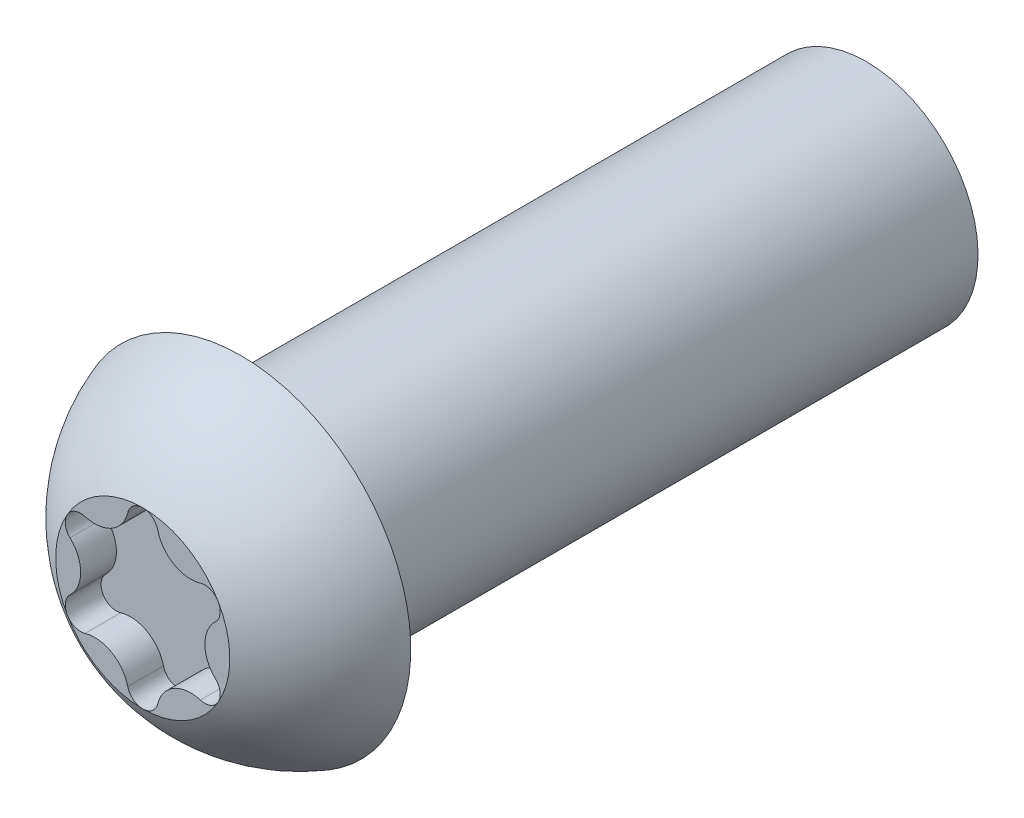
ISO-10303-21;
HEADER;
FILE_DESCRIPTION(('STEP AP214'),'2;1');
FILE_NAME('part.step','',(''),(''),'','','');
FILE_SCHEMA(('AUTOMOTIVE_DESIGN { 1 0 10303 214 1 1 1 1 }'));
ENDSEC;
DATA;
#1=APPLICATION_CONTEXT('core data for automotive mechanical design processes');
#2=APPLICATION_PROTOCOL_DEFINITION('international standard','automotive_design',2000,#1);
#3=PRODUCT_CONTEXT('',#1,'mechanical');
#4=PRODUCT('Part','Part','',(#3));
#5=PRODUCT_RELATED_PRODUCT_CATEGORY('part','',(#4));
#6=PRODUCT_DEFINITION_FORMATION('','',#4);
#7=PRODUCT_DEFINITION_CONTEXT('part definition',#1,'design');
#8=PRODUCT_DEFINITION('design','',#6,#7);
#9=PRODUCT_DEFINITION_SHAPE('','',#8);
#10=(LENGTH_UNIT() NAMED_UNIT(*) SI_UNIT(.MILLI.,.METRE.));
#11=(NAMED_UNIT(*) PLANE_ANGLE_UNIT() SI_UNIT($,.RADIAN.));
#12=(NAMED_UNIT(*) SI_UNIT($,.STERADIAN.) SOLID_ANGLE_UNIT());
#13=UNCERTAINTY_MEASURE_WITH_UNIT(LENGTH_MEASURE(1.E-05),#10,'distance_accuracy_value','');
#14=(GEOMETRIC_REPRESENTATION_CONTEXT(3) GLOBAL_UNCERTAINTY_ASSIGNED_CONTEXT((#13)) GLOBAL_UNIT_ASSIGNED_CONTEXT((#10,
#11,#12)) REPRESENTATION_CONTEXT('',''));
#15=CARTESIAN_POINT('',(0.,0.,0.));
#16=DIRECTION('',(0.,0.,1.));
#17=DIRECTION('',(1.,0.,0.));
#18=AXIS2_PLACEMENT_3D('',#15,#16,#17);
#19=CARTESIAN_POINT('',(0.,0.,2.2));
#20=DIRECTION('',(0.,0.,1.));
#21=DIRECTION('',(0.,-1.,0.));
#22=AXIS2_PLACEMENT_3D('',#19,#20,#21);
#23=PLANE('',#22);
#24=CARTESIAN_POINT('',(1.39012129472943,0.802586903718268,2.2));
#25=DIRECTION('',(0.,0.,1.));
#26=DIRECTION('',(-1.,0.,0.));
#27=AXIS2_PLACEMENT_3D('',#24,#25,#26);
#28=CIRCLE('',#27,0.34482619256347);
#29=CARTESIAN_POINT('',(1.62747995888628,0.552455003258741,2.2));
#30=VERTEX_POINT('',#29);
#31=CARTESIAN_POINT('',(1.68874953737966,0.975000000000003,2.2));
#32=VERTEX_POINT('',#31);
#33=EDGE_CURVE('E223',#30,#32,#28,.T.);
#34=ORIENTED_EDGE('',*,*,#33,.F.);
#35=CARTESIAN_POINT('',(2.15172329346039,0.,2.2));
#36=DIRECTION('',(0.,0.,-1.));
#37=DIRECTION('',(1.,0.,0.));
#38=AXIS2_PLACEMENT_3D('',#35,#36,#37);
#39=CIRCLE('',#38,0.761601998730961);
#40=CARTESIAN_POINT('',(1.62747995888628,-0.552455003258736,2.2));
#41=VERTEX_POINT('',#40);
#42=EDGE_CURVE('E219',#41,#30,#39,.T.);
#43=ORIENTED_EDGE('',*,*,#42,.F.);
#44=CARTESIAN_POINT('',(1.39012129472943,-0.802586903718263,2.2));
#45=DIRECTION('',(0.,0.,1.));
#46=DIRECTION('',(-1.,0.,0.));
#47=AXIS2_PLACEMENT_3D('',#44,#45,#46);
#48=CIRCLE('',#47,0.34482619256347);
#49=CARTESIAN_POINT('',(1.68874953737966,-0.974999999999997,2.2));
#50=VERTEX_POINT('',#49);
#51=EDGE_CURVE('E216',#50,#41,#48,.T.);
#52=ORIENTED_EDGE('',*,*,#51,.F.);
#53=CARTESIAN_POINT('',(0.,0.,2.2));
#54=DIRECTION('',(0.,0.,-1.));
#55=DIRECTION('',(0.,1.,0.));
#56=AXIS2_PLACEMENT_3D('',#53,#54,#55);
#57=CIRCLE('',#56,1.95);
#58=EDGE_CURVE('E45',#32,#50,#57,.T.);
#59=ORIENTED_EDGE('',*,*,#58,.F.);
#60=EDGE_LOOP('',(#34,#43,#52,#59));
#61=FACE_BOUND('',#60,.T.);
#62=ADVANCED_FACE('F37',(#61),#23,.T.);
#63=CARTESIAN_POINT('',(1.29218004671302,1.1332114869162,2.2));
#64=VERTEX_POINT('',#63);
#65=EDGE_CURVE('E222',#32,#64,#28,.T.);
#66=ORIENTED_EDGE('',*,*,#65,.F.);
#67=CARTESIAN_POINT('',(0.,1.95,2.2));
#68=VERTEX_POINT('',#67);
#69=EDGE_CURVE('E11',#68,#32,#57,.T.);
#70=ORIENTED_EDGE('',*,*,#69,.F.);
#71=CARTESIAN_POINT('',(0.,1.60517380743653,2.2));
#72=DIRECTION('',(0.,0.,1.));
#73=DIRECTION('',(-1.,0.,0.));
#74=AXIS2_PLACEMENT_3D('',#71,#72,#73);
#75=CIRCLE('',#74,0.34482619256347);
#76=CARTESIAN_POINT('',(0.335299912173256,1.68566649017494,2.2));
#77=VERTEX_POINT('',#76);
#78=EDGE_CURVE('E61',#77,#68,#75,.T.);
#79=ORIENTED_EDGE('',*,*,#78,.F.);
#80=CARTESIAN_POINT('',(1.07586164673019,1.86344703405141,2.2));
#81=DIRECTION('',(0.,0.,-1.));
#82=DIRECTION('',(1.,0.,0.));
#83=AXIS2_PLACEMENT_3D('',#80,#81,#82);
#84=CIRCLE('',#83,0.76160199873096);
#85=EDGE_CURVE('E225',#64,#77,#84,.T.);
#86=ORIENTED_EDGE('',*,*,#85,.F.);
#87=EDGE_LOOP('',(#66,#70,#79,#86));
#88=FACE_BOUND('',#87,.T.);
#89=ADVANCED_FACE('F308',(#88),#23,.T.);
#90=CARTESIAN_POINT('',(1.29218004671303,-1.1332114869162,2.2));
#91=VERTEX_POINT('',#90);
#92=EDGE_CURVE('E217',#91,#50,#48,.T.);
#93=ORIENTED_EDGE('',*,*,#92,.F.);
#94=CARTESIAN_POINT('',(1.0758616467302,-1.86344703405141,2.2));
#95=DIRECTION('',(0.,0.,-1.));
#96=DIRECTION('',(1.,0.,0.));
#97=AXIS2_PLACEMENT_3D('',#94,#95,#96);
#98=CIRCLE('',#97,0.761601998730961);
#99=CARTESIAN_POINT('',(0.335299912173264,-1.68566649017494,2.2));
#100=VERTEX_POINT('',#99);
#101=EDGE_CURVE('E213',#100,#91,#98,.T.);
#102=ORIENTED_EDGE('',*,*,#101,.F.);
#103=CARTESIAN_POINT('',(0.,-1.60517380743653,2.2));
#104=DIRECTION('',(0.,0.,1.));
#105=DIRECTION('',(-1.,0.,0.));
#106=AXIS2_PLACEMENT_3D('',#103,#104,#105);
#107=CIRCLE('',#106,0.34482619256347);
#108=CARTESIAN_POINT('',(0.,-1.95,2.2));
#109=VERTEX_POINT('',#108);
#110=EDGE_CURVE('E210',#109,#100,#107,.T.);
#111=ORIENTED_EDGE('',*,*,#110,.F.);
#112=EDGE_CURVE('E271',#50,#109,#57,.T.);
#113=ORIENTED_EDGE('',*,*,#112,.F.);
#114=EDGE_LOOP('',(#93,#102,#111,#113));
#115=FACE_BOUND('',#114,.T.);
#116=ADVANCED_FACE('F287',(#115),#23,.T.);
#117=CARTESIAN_POINT('',(-0.335299912173256,1.68566649017494,2.2));
#118=VERTEX_POINT('',#117);
#119=EDGE_CURVE('E170',#68,#118,#75,.T.);
#120=ORIENTED_EDGE('',*,*,#119,.F.);
#121=CARTESIAN_POINT('',(-1.68874953737966,0.974999999999996,2.2));
#122=VERTEX_POINT('',#121);
#123=EDGE_CURVE('E46',#122,#68,#57,.T.);
#124=ORIENTED_EDGE('',*,*,#123,.F.);
#125=CARTESIAN_POINT('',(-1.39012129472943,0.80258690371826,2.2));
#126=DIRECTION('',(0.,0.,1.));
#127=DIRECTION('',(-1.,0.,0.));
#128=AXIS2_PLACEMENT_3D('',#125,#126,#127);
#129=CIRCLE('',#128,0.34482619256347);
#130=CARTESIAN_POINT('',(-1.29218004671302,1.13321148691619,2.2));
#131=VERTEX_POINT('',#130);
#132=EDGE_CURVE('E53',#131,#122,#129,.T.);
#133=ORIENTED_EDGE('',*,*,#132,.F.);
#134=CARTESIAN_POINT('',(-1.07586164673019,1.86344703405141,2.2));
#135=DIRECTION('',(0.,0.,-1.));
#136=DIRECTION('',(1.,0.,0.));
#137=AXIS2_PLACEMENT_3D('',#134,#135,#136);
#138=CIRCLE('',#137,0.761601998730961);
#139=EDGE_CURVE('E153',#118,#131,#138,.T.);
#140=ORIENTED_EDGE('',*,*,#139,.F.);
#141=EDGE_LOOP('',(#120,#124,#133,#140));
#142=FACE_BOUND('',#141,.T.);
#143=ADVANCED_FACE('F300',(#142),#23,.T.);
#144=CARTESIAN_POINT('',(-0.335299912173248,-1.68566649017494,2.2));
#145=VERTEX_POINT('',#144);
#146=EDGE_CURVE('E211',#145,#109,#107,.T.);
#147=ORIENTED_EDGE('',*,*,#146,.F.);
#148=CARTESIAN_POINT('',(-1.07586164673019,-1.86344703405142,2.2));
#149=DIRECTION('',(0.,0.,-1.));
#150=DIRECTION('',(1.,0.,0.));
#151=AXIS2_PLACEMENT_3D('',#148,#149,#150);
#152=CIRCLE('',#151,0.761601998730961);
#153=CARTESIAN_POINT('',(-1.29218004671301,-1.1332114869162,2.2));
#154=VERTEX_POINT('',#153);
#155=EDGE_CURVE('E207',#154,#145,#152,.T.);
#156=ORIENTED_EDGE('',*,*,#155,.F.);
#157=CARTESIAN_POINT('',(-1.39012129472942,-0.802586903718271,2.2));
#158=DIRECTION('',(0.,0.,1.));
#159=DIRECTION('',(-1.,0.,0.));
#160=AXIS2_PLACEMENT_3D('',#157,#158,#159);
#161=CIRCLE('',#160,0.34482619256347);
#162=CARTESIAN_POINT('',(-1.68874953737965,-0.975000000000007,2.2));
#163=VERTEX_POINT('',#162);
#164=EDGE_CURVE('E204',#163,#154,#161,.T.);
#165=ORIENTED_EDGE('',*,*,#164,.F.);
#166=EDGE_CURVE('E268',#109,#163,#57,.T.);
#167=ORIENTED_EDGE('',*,*,#166,.F.);
#168=EDGE_LOOP('',(#147,#156,#165,#167));
#169=FACE_BOUND('',#168,.T.);
#170=ADVANCED_FACE('F293',(#169),#23,.T.);
#171=CARTESIAN_POINT('',(-1.62747995888627,-0.552455003258743,2.2));
#172=VERTEX_POINT('',#171);
#173=EDGE_CURVE('E205',#172,#163,#161,.T.);
#174=ORIENTED_EDGE('',*,*,#173,.F.);
#175=CARTESIAN_POINT('',(-2.15172329346038,0.,2.2));
#176=DIRECTION('',(0.,0.,-1.));
#177=DIRECTION('',(1.,0.,0.));
#178=AXIS2_PLACEMENT_3D('',#175,#176,#177);
#179=CIRCLE('',#178,0.76160199873096);
#180=CARTESIAN_POINT('',(-1.62747995888627,0.552455003258734,2.2));
#181=VERTEX_POINT('',#180);
#182=EDGE_CURVE('E201',#181,#172,#179,.T.);
#183=ORIENTED_EDGE('',*,*,#182,.F.);
#184=EDGE_CURVE('E199',#122,#181,#129,.T.);
#185=ORIENTED_EDGE('',*,*,#184,.F.);
#186=EDGE_CURVE('E263',#163,#122,#57,.T.);
#187=ORIENTED_EDGE('',*,*,#186,.F.);
#188=EDGE_LOOP('',(#174,#183,#185,#187));
#189=FACE_BOUND('',#188,.T.);
#190=ADVANCED_FACE('F39',(#189),#23,.T.);
#191=CARTESIAN_POINT('',(0.,0.,-1.31761363636364));
#192=DIRECTION('',(0.,0.,-1.));
#193=DIRECTION('',(0.,1.,0.));
#194=AXIS2_PLACEMENT_3D('',#191,#192,#193);
#195=SPHERICAL_SURFACE('',#194,4.02195297022869);
#196=ORIENTED_EDGE('',*,*,#69,.T.);
#197=ORIENTED_EDGE('',*,*,#58,.T.);
#198=ORIENTED_EDGE('',*,*,#112,.T.);
#199=ORIENTED_EDGE('',*,*,#166,.T.);
#200=ORIENTED_EDGE('',*,*,#186,.T.);
#201=ORIENTED_EDGE('',*,*,#123,.T.);
#202=EDGE_LOOP('',(#196,#197,#198,#199,#200,#201));
#203=FACE_BOUND('',#202,.T.);
#204=CARTESIAN_POINT('',(0.,0.,0.));
#205=DIRECTION('',(0.,0.,-1.));
#206=DIRECTION('',(0.,1.,0.));
#207=AXIS2_PLACEMENT_3D('',#204,#205,#206);
#208=CIRCLE('',#207,3.8);
#209=CARTESIAN_POINT('',(0.,3.8,0.));
#210=VERTEX_POINT('',#209);
#211=EDGE_CURVE('E258',#210,#210,#208,.T.);
#212=ORIENTED_EDGE('',*,*,#211,.F.);
#213=EDGE_LOOP('',(#212));
#214=FACE_BOUND('',#213,.T.);
#215=ADVANCED_FACE('F277',(#203,#214),#195,.T.);
#216=CARTESIAN_POINT('',(0.,3.8,0.));
#217=DIRECTION('',(0.,0.,-1.));
#218=DIRECTION('',(0.,1.,0.));
#219=AXIS2_PLACEMENT_3D('',#216,#217,#218);
#220=PLANE('',#219);
#221=ORIENTED_EDGE('',*,*,#211,.T.);
#222=EDGE_LOOP('',(#221));
#223=FACE_BOUND('',#222,.T.);
#224=CARTESIAN_POINT('',(0.,0.,0.));
#225=DIRECTION('',(0.,0.,-1.));
#226=DIRECTION('',(0.,1.,0.));
#227=AXIS2_PLACEMENT_3D('',#224,#225,#226);
#228=CIRCLE('',#227,2.5);
#229=CARTESIAN_POINT('',(0.,2.5,0.));
#230=VERTEX_POINT('',#229);
#231=EDGE_CURVE('E256',#230,#230,#228,.T.);
#232=ORIENTED_EDGE('',*,*,#231,.F.);
#233=EDGE_LOOP('',(#232));
#234=FACE_BOUND('',#233,.T.);
#235=ADVANCED_FACE('F346',(#223,#234),#220,.T.);
#236=CARTESIAN_POINT('',(0.,0.,2.2));
#237=DIRECTION('',(0.,0.,-1.));
#238=DIRECTION('',(0.,1.,0.));
#239=AXIS2_PLACEMENT_3D('',#236,#237,#238);
#240=CYLINDRICAL_SURFACE('',#239,2.5);
#241=ORIENTED_EDGE('',*,*,#231,.T.);
#242=EDGE_LOOP('',(#241));
#243=FACE_BOUND('',#242,.T.);
#244=CARTESIAN_POINT('',(0.,0.,-14.));
#245=DIRECTION('',(0.,0.,-1.));
#246=DIRECTION('',(0.,1.,0.));
#247=AXIS2_PLACEMENT_3D('',#244,#245,#246);
#248=CIRCLE('',#247,2.5);
#249=CARTESIAN_POINT('',(0.,2.5,-14.));
#250=VERTEX_POINT('',#249);
#251=EDGE_CURVE('E230',#250,#250,#248,.T.);
#252=ORIENTED_EDGE('',*,*,#251,.F.);
#253=EDGE_LOOP('',(#252));
#254=FACE_BOUND('',#253,.T.);
#255=ADVANCED_FACE('F374',(#243,#254),#240,.T.);
#256=CARTESIAN_POINT('',(0.,2.5,-14.));
#257=DIRECTION('',(0.,0.,-1.));
#258=DIRECTION('',(0.,1.,0.));
#259=AXIS2_PLACEMENT_3D('',#256,#257,#258);
#260=PLANE('',#259);
#261=ORIENTED_EDGE('',*,*,#251,.T.);
#262=EDGE_LOOP('',(#261));
#263=FACE_BOUND('',#262,.T.);
#264=ADVANCED_FACE('F369',(#263),#260,.T.);
#265=CARTESIAN_POINT('',(-1.07586164673019,1.86344703405141,1.4));
#266=DIRECTION('',(0.,0.,1.));
#267=DIRECTION('',(1.,0.,0.));
#268=AXIS2_PLACEMENT_3D('',#265,#266,#267);
#269=CYLINDRICAL_SURFACE('',#268,0.761601998730961);
#270=ORIENTED_EDGE('',*,*,#139,.T.);
#271=DIRECTION('',(0.,0.,1.));
#272=VECTOR('',#271,1.);
#273=CARTESIAN_POINT('',(-1.29218004671302,1.13321148691619,1.4));
#274=LINE('',#273,#272);
#275=CARTESIAN_POINT('',(-1.29218004671302,1.13321148691619,1.4));
#276=VERTEX_POINT('',#275);
#277=EDGE_CURVE('E145',#276,#131,#274,.T.);
#278=ORIENTED_EDGE('',*,*,#277,.F.);
#279=CARTESIAN_POINT('',(-1.07586164673019,1.86344703405141,1.4));
#280=DIRECTION('',(0.,0.,-1.));
#281=DIRECTION('',(1.,0.,0.));
#282=AXIS2_PLACEMENT_3D('',#279,#280,#281);
#283=CIRCLE('',#282,0.761601998730961);
#284=CARTESIAN_POINT('',(-0.335299912173256,1.68566649017494,1.4));
#285=VERTEX_POINT('',#284);
#286=EDGE_CURVE('E150',#285,#276,#283,.T.);
#287=ORIENTED_EDGE('',*,*,#286,.F.);
#288=DIRECTION('',(0.,0.,1.));
#289=VECTOR('',#288,1.);
#290=CARTESIAN_POINT('',(-0.335299912173256,1.68566649017494,1.4));
#291=LINE('',#290,#289);
#292=EDGE_CURVE('E228',#285,#118,#291,.T.);
#293=ORIENTED_EDGE('',*,*,#292,.T.);
#294=EDGE_LOOP('',(#270,#278,#287,#293));
#295=FACE_BOUND('',#294,.T.);
#296=ADVANCED_FACE('F147',(#295),#269,.T.);
#297=CARTESIAN_POINT('',(0.,1.60517380743653,1.4));
#298=DIRECTION('',(0.,0.,1.));
#299=DIRECTION('',(1.,0.,0.));
#300=AXIS2_PLACEMENT_3D('',#297,#298,#299);
#301=CYLINDRICAL_SURFACE('',#300,0.34482619256347);
#302=ORIENTED_EDGE('',*,*,#78,.T.);
#303=ORIENTED_EDGE('',*,*,#119,.T.);
#304=ORIENTED_EDGE('',*,*,#292,.F.);
#305=CARTESIAN_POINT('',(0.,1.60517380743653,1.4));
#306=DIRECTION('',(0.,0.,1.));
#307=DIRECTION('',(-1.,0.,0.));
#308=AXIS2_PLACEMENT_3D('',#305,#306,#307);
#309=CIRCLE('',#308,0.34482619256347);
#310=CARTESIAN_POINT('',(0.335299912173256,1.68566649017494,1.4));
#311=VERTEX_POINT('',#310);
#312=EDGE_CURVE('E155',#311,#285,#309,.T.);
#313=ORIENTED_EDGE('',*,*,#312,.F.);
#314=DIRECTION('',(0.,0.,1.));
#315=VECTOR('',#314,1.);
#316=CARTESIAN_POINT('',(0.335299912173256,1.68566649017494,1.4));
#317=LINE('',#316,#315);
#318=EDGE_CURVE('E231',#311,#77,#317,.T.);
#319=ORIENTED_EDGE('',*,*,#318,.T.);
#320=EDGE_LOOP('',(#302,#303,#304,#313,#319));
#321=FACE_BOUND('',#320,.T.);
#322=ADVANCED_FACE('F301',(#321),#301,.F.);
#323=CARTESIAN_POINT('',(1.07586164673019,1.86344703405141,1.4));
#324=DIRECTION('',(0.,0.,1.));
#325=DIRECTION('',(1.,0.,0.));
#326=AXIS2_PLACEMENT_3D('',#323,#324,#325);
#327=CYLINDRICAL_SURFACE('',#326,0.76160199873096);
#328=ORIENTED_EDGE('',*,*,#85,.T.);
#329=ORIENTED_EDGE('',*,*,#318,.F.);
#330=CARTESIAN_POINT('',(1.07586164673019,1.86344703405141,1.4));
#331=DIRECTION('',(0.,0.,-1.));
#332=DIRECTION('',(1.,0.,0.));
#333=AXIS2_PLACEMENT_3D('',#330,#331,#332);
#334=CIRCLE('',#333,0.76160199873096);
#335=CARTESIAN_POINT('',(1.29218004671302,1.1332114869162,1.4));
#336=VERTEX_POINT('',#335);
#337=EDGE_CURVE('E195',#336,#311,#334,.T.);
#338=ORIENTED_EDGE('',*,*,#337,.F.);
#339=DIRECTION('',(0.,0.,1.));
#340=VECTOR('',#339,1.);
#341=CARTESIAN_POINT('',(1.29218004671302,1.1332114869162,1.4));
#342=LINE('',#341,#340);
#343=EDGE_CURVE('E233',#336,#64,#342,.T.);
#344=ORIENTED_EDGE('',*,*,#343,.T.);
#345=EDGE_LOOP('',(#328,#329,#338,#344));
#346=FACE_BOUND('',#345,.T.);
#347=ADVANCED_FACE('F305',(#346),#327,.T.);
#348=CARTESIAN_POINT('',(1.39012129472943,0.802586903718268,1.4));
#349=DIRECTION('',(0.,0.,1.));
#350=DIRECTION('',(1.,0.,0.));
#351=AXIS2_PLACEMENT_3D('',#348,#349,#350);
#352=CYLINDRICAL_SURFACE('',#351,0.34482619256347);
#353=ORIENTED_EDGE('',*,*,#33,.T.);
#354=ORIENTED_EDGE('',*,*,#65,.T.);
#355=ORIENTED_EDGE('',*,*,#343,.F.);
#356=CARTESIAN_POINT('',(1.39012129472943,0.802586903718268,1.4));
#357=DIRECTION('',(0.,0.,1.));
#358=DIRECTION('',(-1.,0.,0.));
#359=AXIS2_PLACEMENT_3D('',#356,#357,#358);
#360=CIRCLE('',#359,0.34482619256347);
#361=CARTESIAN_POINT('',(1.62747995888628,0.552455003258741,1.4));
#362=VERTEX_POINT('',#361);
#363=EDGE_CURVE('E192',#362,#336,#360,.T.);
#364=ORIENTED_EDGE('',*,*,#363,.F.);
#365=DIRECTION('',(0.,0.,1.));
#366=VECTOR('',#365,1.);
#367=CARTESIAN_POINT('',(1.62747995888628,0.552455003258741,1.4));
#368=LINE('',#367,#366);
#369=EDGE_CURVE('E236',#362,#30,#368,.T.);
#370=ORIENTED_EDGE('',*,*,#369,.T.);
#371=EDGE_LOOP('',(#353,#354,#355,#364,#370));
#372=FACE_BOUND('',#371,.T.);
#373=ADVANCED_FACE('F310',(#372),#352,.F.);
#374=CARTESIAN_POINT('',(2.15172329346039,0.,1.4));
#375=DIRECTION('',(0.,0.,1.));
#376=DIRECTION('',(1.,0.,0.));
#377=AXIS2_PLACEMENT_3D('',#374,#375,#376);
#378=CYLINDRICAL_SURFACE('',#377,0.761601998730961);
#379=ORIENTED_EDGE('',*,*,#42,.T.);
#380=ORIENTED_EDGE('',*,*,#369,.F.);
#381=CARTESIAN_POINT('',(2.15172329346039,0.,1.4));
#382=DIRECTION('',(0.,0.,-1.));
#383=DIRECTION('',(1.,0.,0.));
#384=AXIS2_PLACEMENT_3D('',#381,#382,#383);
#385=CIRCLE('',#384,0.761601998730961);
#386=CARTESIAN_POINT('',(1.62747995888628,-0.552455003258736,1.4));
#387=VERTEX_POINT('',#386);
#388=EDGE_CURVE('E189',#387,#362,#385,.T.);
#389=ORIENTED_EDGE('',*,*,#388,.F.);
#390=DIRECTION('',(0.,0.,1.));
#391=VECTOR('',#390,1.);
#392=CARTESIAN_POINT('',(1.62747995888628,-0.552455003258736,1.4));
#393=LINE('',#392,#391);
#394=EDGE_CURVE('E238',#387,#41,#393,.T.);
#395=ORIENTED_EDGE('',*,*,#394,.T.);
#396=EDGE_LOOP('',(#379,#380,#389,#395));
#397=FACE_BOUND('',#396,.T.);
#398=ADVANCED_FACE('F314',(#397),#378,.T.);
#399=CARTESIAN_POINT('',(1.39012129472943,-0.802586903718263,1.4));
#400=DIRECTION('',(0.,0.,1.));
#401=DIRECTION('',(1.,0.,0.));
#402=AXIS2_PLACEMENT_3D('',#399,#400,#401);
#403=CYLINDRICAL_SURFACE('',#402,0.34482619256347);
#404=ORIENTED_EDGE('',*,*,#92,.T.);
#405=ORIENTED_EDGE('',*,*,#51,.T.);
#406=ORIENTED_EDGE('',*,*,#394,.F.);
#407=CARTESIAN_POINT('',(1.39012129472943,-0.802586903718263,1.4));
#408=DIRECTION('',(0.,0.,1.));
#409=DIRECTION('',(-1.,0.,0.));
#410=AXIS2_PLACEMENT_3D('',#407,#408,#409);
#411=CIRCLE('',#410,0.34482619256347);
#412=CARTESIAN_POINT('',(1.29218004671303,-1.1332114869162,1.4));
#413=VERTEX_POINT('',#412);
#414=EDGE_CURVE('E186',#413,#387,#411,.T.);
#415=ORIENTED_EDGE('',*,*,#414,.F.);
#416=DIRECTION('',(0.,0.,1.));
#417=VECTOR('',#416,1.);
#418=CARTESIAN_POINT('',(1.29218004671303,-1.1332114869162,1.4));
#419=LINE('',#418,#417);
#420=EDGE_CURVE('E241',#413,#91,#419,.T.);
#421=ORIENTED_EDGE('',*,*,#420,.T.);
#422=EDGE_LOOP('',(#404,#405,#406,#415,#421));
#423=FACE_BOUND('',#422,.T.);
#424=ADVANCED_FACE('F316',(#423),#403,.F.);
#425=CARTESIAN_POINT('',(1.0758616467302,-1.86344703405141,1.4));
#426=DIRECTION('',(0.,0.,1.));
#427=DIRECTION('',(1.,0.,0.));
#428=AXIS2_PLACEMENT_3D('',#425,#426,#427);
#429=CYLINDRICAL_SURFACE('',#428,0.761601998730961);
#430=ORIENTED_EDGE('',*,*,#101,.T.);
#431=ORIENTED_EDGE('',*,*,#420,.F.);
#432=CARTESIAN_POINT('',(1.0758616467302,-1.86344703405141,1.4));
#433=DIRECTION('',(0.,0.,-1.));
#434=DIRECTION('',(1.,0.,0.));
#435=AXIS2_PLACEMENT_3D('',#432,#433,#434);
#436=CIRCLE('',#435,0.761601998730961);
#437=CARTESIAN_POINT('',(0.335299912173264,-1.68566649017494,1.4));
#438=VERTEX_POINT('',#437);
#439=EDGE_CURVE('E183',#438,#413,#436,.T.);
#440=ORIENTED_EDGE('',*,*,#439,.F.);
#441=DIRECTION('',(0.,0.,1.));
#442=VECTOR('',#441,1.);
#443=CARTESIAN_POINT('',(0.335299912173264,-1.68566649017494,1.4));
#444=LINE('',#443,#442);
#445=EDGE_CURVE('E243',#438,#100,#444,.T.);
#446=ORIENTED_EDGE('',*,*,#445,.T.);
#447=EDGE_LOOP('',(#430,#431,#440,#446));
#448=FACE_BOUND('',#447,.T.);
#449=ADVANCED_FACE('F320',(#448),#429,.T.);
#450=CARTESIAN_POINT('',(0.,-1.60517380743653,1.4));
#451=DIRECTION('',(0.,0.,1.));
#452=DIRECTION('',(1.,0.,0.));
#453=AXIS2_PLACEMENT_3D('',#450,#451,#452);
#454=CYLINDRICAL_SURFACE('',#453,0.34482619256347);
#455=ORIENTED_EDGE('',*,*,#146,.T.);
#456=ORIENTED_EDGE('',*,*,#110,.T.);
#457=ORIENTED_EDGE('',*,*,#445,.F.);
#458=CARTESIAN_POINT('',(0.,-1.60517380743653,1.4));
#459=DIRECTION('',(0.,0.,1.));
#460=DIRECTION('',(-1.,0.,0.));
#461=AXIS2_PLACEMENT_3D('',#458,#459,#460);
#462=CIRCLE('',#461,0.34482619256347);
#463=CARTESIAN_POINT('',(-0.335299912173248,-1.68566649017494,1.4));
#464=VERTEX_POINT('',#463);
#465=EDGE_CURVE('E180',#464,#438,#462,.T.);
#466=ORIENTED_EDGE('',*,*,#465,.F.);
#467=DIRECTION('',(0.,0.,1.));
#468=VECTOR('',#467,1.);
#469=CARTESIAN_POINT('',(-0.335299912173248,-1.68566649017494,1.4));
#470=LINE('',#469,#468);
#471=EDGE_CURVE('E246',#464,#145,#470,.T.);
#472=ORIENTED_EDGE('',*,*,#471,.T.);
#473=EDGE_LOOP('',(#455,#456,#457,#466,#472));
#474=FACE_BOUND('',#473,.T.);
#475=ADVANCED_FACE('F321',(#474),#454,.F.);
#476=CARTESIAN_POINT('',(-1.07586164673019,-1.86344703405142,1.4));
#477=DIRECTION('',(0.,0.,1.));
#478=DIRECTION('',(1.,0.,0.));
#479=AXIS2_PLACEMENT_3D('',#476,#477,#478);
#480=CYLINDRICAL_SURFACE('',#479,0.761601998730961);
#481=ORIENTED_EDGE('',*,*,#155,.T.);
#482=ORIENTED_EDGE('',*,*,#471,.F.);
#483=CARTESIAN_POINT('',(-1.07586164673019,-1.86344703405142,1.4));
#484=DIRECTION('',(0.,0.,-1.));
#485=DIRECTION('',(1.,0.,0.));
#486=AXIS2_PLACEMENT_3D('',#483,#484,#485);
#487=CIRCLE('',#486,0.761601998730961);
#488=CARTESIAN_POINT('',(-1.29218004671301,-1.1332114869162,1.4));
#489=VERTEX_POINT('',#488);
#490=EDGE_CURVE('E177',#489,#464,#487,.T.);
#491=ORIENTED_EDGE('',*,*,#490,.F.);
#492=DIRECTION('',(0.,0.,1.));
#493=VECTOR('',#492,1.);
#494=CARTESIAN_POINT('',(-1.29218004671301,-1.1332114869162,1.4));
#495=LINE('',#494,#493);
#496=EDGE_CURVE('E248',#489,#154,#495,.T.);
#497=ORIENTED_EDGE('',*,*,#496,.T.);
#498=EDGE_LOOP('',(#481,#482,#491,#497));
#499=FACE_BOUND('',#498,.T.);
#500=ADVANCED_FACE('F325',(#499),#480,.T.);
#501=CARTESIAN_POINT('',(-1.39012129472942,-0.802586903718271,1.4));
#502=DIRECTION('',(0.,0.,1.));
#503=DIRECTION('',(1.,0.,0.));
#504=AXIS2_PLACEMENT_3D('',#501,#502,#503);
#505=CYLINDRICAL_SURFACE('',#504,0.34482619256347);
#506=ORIENTED_EDGE('',*,*,#173,.T.);
#507=ORIENTED_EDGE('',*,*,#164,.T.);
#508=ORIENTED_EDGE('',*,*,#496,.F.);
#509=CARTESIAN_POINT('',(-1.39012129472942,-0.802586903718271,1.4));
#510=DIRECTION('',(0.,0.,1.));
#511=DIRECTION('',(-1.,0.,0.));
#512=AXIS2_PLACEMENT_3D('',#509,#510,#511);
#513=CIRCLE('',#512,0.34482619256347);
#514=CARTESIAN_POINT('',(-1.62747995888627,-0.552455003258743,1.4));
#515=VERTEX_POINT('',#514);
#516=EDGE_CURVE('E174',#515,#489,#513,.T.);
#517=ORIENTED_EDGE('',*,*,#516,.F.);
#518=DIRECTION('',(0.,0.,1.));
#519=VECTOR('',#518,1.);
#520=CARTESIAN_POINT('',(-1.62747995888627,-0.552455003258743,1.4));
#521=LINE('',#520,#519);
#522=EDGE_CURVE('E251',#515,#172,#521,.T.);
#523=ORIENTED_EDGE('',*,*,#522,.T.);
#524=EDGE_LOOP('',(#506,#507,#508,#517,#523));
#525=FACE_BOUND('',#524,.T.);
#526=ADVANCED_FACE('F326',(#525),#505,.F.);
#527=CARTESIAN_POINT('',(-2.15172329346038,0.,1.4));
#528=DIRECTION('',(0.,0.,1.));
#529=DIRECTION('',(1.,0.,0.));
#530=AXIS2_PLACEMENT_3D('',#527,#528,#529);
#531=CYLINDRICAL_SURFACE('',#530,0.76160199873096);
#532=ORIENTED_EDGE('',*,*,#182,.T.);
#533=ORIENTED_EDGE('',*,*,#522,.F.);
#534=CARTESIAN_POINT('',(-2.15172329346038,0.,1.4));
#535=DIRECTION('',(0.,0.,-1.));
#536=DIRECTION('',(1.,0.,0.));
#537=AXIS2_PLACEMENT_3D('',#534,#535,#536);
#538=CIRCLE('',#537,0.76160199873096);
#539=CARTESIAN_POINT('',(-1.62747995888627,0.552455003258734,1.4));
#540=VERTEX_POINT('',#539);
#541=EDGE_CURVE('E164',#540,#515,#538,.T.);
#542=ORIENTED_EDGE('',*,*,#541,.F.);
#543=DIRECTION('',(0.,0.,1.));
#544=VECTOR('',#543,1.);
#545=CARTESIAN_POINT('',(-1.62747995888627,0.552455003258734,1.4));
#546=LINE('',#545,#544);
#547=EDGE_CURVE('E154',#540,#181,#546,.T.);
#548=ORIENTED_EDGE('',*,*,#547,.T.);
#549=EDGE_LOOP('',(#532,#533,#542,#548));
#550=FACE_BOUND('',#549,.T.);
#551=ADVANCED_FACE('F328',(#550),#531,.T.);
#552=CARTESIAN_POINT('',(-1.39012129472943,0.80258690371826,1.4));
#553=DIRECTION('',(0.,0.,1.));
#554=DIRECTION('',(1.,0.,0.));
#555=AXIS2_PLACEMENT_3D('',#552,#553,#554);
#556=CYLINDRICAL_SURFACE('',#555,0.34482619256347);
#557=ORIENTED_EDGE('',*,*,#132,.T.);
#558=ORIENTED_EDGE('',*,*,#184,.T.);
#559=ORIENTED_EDGE('',*,*,#547,.F.);
#560=CARTESIAN_POINT('',(-1.39012129472943,0.80258690371826,1.4));
#561=DIRECTION('',(0.,0.,1.));
#562=DIRECTION('',(-1.,0.,0.));
#563=AXIS2_PLACEMENT_3D('',#560,#561,#562);
#564=CIRCLE('',#563,0.34482619256347);
#565=EDGE_CURVE('E158',#276,#540,#564,.T.);
#566=ORIENTED_EDGE('',*,*,#565,.F.);
#567=ORIENTED_EDGE('',*,*,#277,.T.);
#568=EDGE_LOOP('',(#557,#558,#559,#566,#567));
#569=FACE_BOUND('',#568,.T.);
#570=ADVANCED_FACE('F159',(#569),#556,.F.);
#571=CARTESIAN_POINT('',(-0.537930823365097,1.73431042074397,1.4));
#572=DIRECTION('',(0.,0.,1.));
#573=DIRECTION('',(1.,0.,0.));
#574=AXIS2_PLACEMENT_3D('',#571,#572,#573);
#575=PLANE('',#574);
#576=ORIENTED_EDGE('',*,*,#286,.T.);
#577=ORIENTED_EDGE('',*,*,#565,.T.);
#578=ORIENTED_EDGE('',*,*,#541,.T.);
#579=ORIENTED_EDGE('',*,*,#516,.T.);
#580=ORIENTED_EDGE('',*,*,#490,.T.);
#581=ORIENTED_EDGE('',*,*,#465,.T.);
#582=ORIENTED_EDGE('',*,*,#439,.T.);
#583=ORIENTED_EDGE('',*,*,#414,.T.);
#584=ORIENTED_EDGE('',*,*,#388,.T.);
#585=ORIENTED_EDGE('',*,*,#363,.T.);
#586=ORIENTED_EDGE('',*,*,#337,.T.);
#587=ORIENTED_EDGE('',*,*,#312,.T.);
#588=EDGE_LOOP('',(#576,#577,#578,#579,#580,#581,#582,#583,#584,#585,#586,#587));
#589=FACE_BOUND('',#588,.T.);
#590=ADVANCED_FACE('F166',(#589),#575,.T.);
#591=CLOSED_SHELL('',(#62,#89,#116,#143,#170,#190,#215,#235,#255,#264,#296,#322,#347,#373,#398,
#424,#449,#475,#500,#526,#551,#570,#590));
#592=MANIFOLD_SOLID_BREP('B2',#591);
#593=ADVANCED_BREP_SHAPE_REPRESENTATION('',(#18,#592),#14);
#594=SHAPE_DEFINITION_REPRESENTATION(#9,#593);
ENDSEC;
END-ISO-10303-21;
